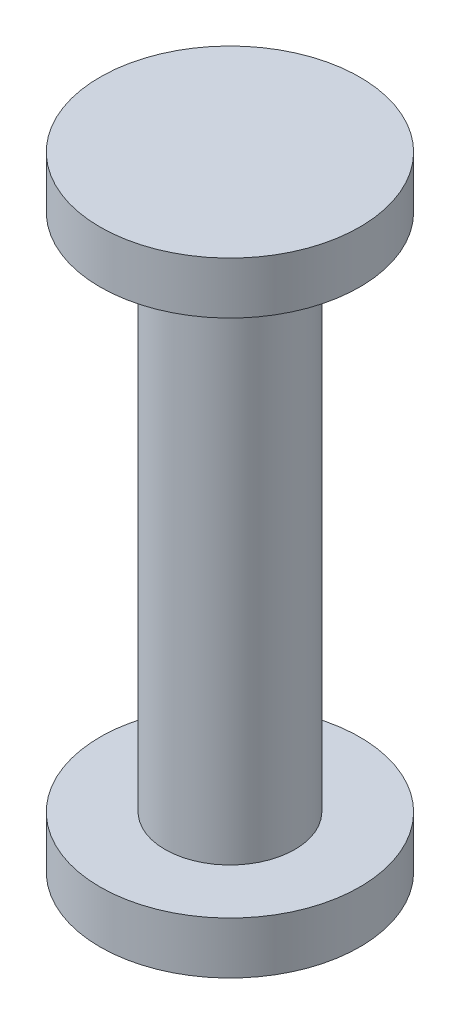
ISO-10303-21;
HEADER;
FILE_DESCRIPTION(('STEP AP214'),'2;1');
FILE_NAME('part.step','',(''),(''),'','','');
FILE_SCHEMA(('AUTOMOTIVE_DESIGN { 1 0 10303 214 1 1 1 1 }'));
ENDSEC;
DATA;
#1=APPLICATION_CONTEXT('core data for automotive mechanical design processes');
#2=APPLICATION_PROTOCOL_DEFINITION('international standard','automotive_design',2000,#1);
#3=PRODUCT_CONTEXT('',#1,'mechanical');
#4=PRODUCT('Part','Part','',(#3));
#5=PRODUCT_RELATED_PRODUCT_CATEGORY('part','',(#4));
#6=PRODUCT_DEFINITION_FORMATION('','',#4);
#7=PRODUCT_DEFINITION_CONTEXT('part definition',#1,'design');
#8=PRODUCT_DEFINITION('design','',#6,#7);
#9=PRODUCT_DEFINITION_SHAPE('','',#8);
#10=(LENGTH_UNIT() NAMED_UNIT(*) SI_UNIT(.MILLI.,.METRE.));
#11=(NAMED_UNIT(*) PLANE_ANGLE_UNIT() SI_UNIT($,.RADIAN.));
#12=(NAMED_UNIT(*) SI_UNIT($,.STERADIAN.) SOLID_ANGLE_UNIT());
#13=UNCERTAINTY_MEASURE_WITH_UNIT(LENGTH_MEASURE(1.E-05),#10,'distance_accuracy_value','');
#14=(GEOMETRIC_REPRESENTATION_CONTEXT(3) GLOBAL_UNCERTAINTY_ASSIGNED_CONTEXT((#13)) GLOBAL_UNIT_ASSIGNED_CONTEXT((#10,
#11,#12)) REPRESENTATION_CONTEXT('',''));
#15=CARTESIAN_POINT('',(0.,0.,0.));
#16=DIRECTION('',(0.,0.,1.));
#17=DIRECTION('',(1.,0.,0.));
#18=AXIS2_PLACEMENT_3D('',#15,#16,#17);
#19=CARTESIAN_POINT('',(0.,7.62,0.));
#20=DIRECTION('',(0.,1.,0.));
#21=DIRECTION('',(0.,0.,1.));
#22=AXIS2_PLACEMENT_3D('',#19,#20,#21);
#23=PLANE('',#22);
#24=CARTESIAN_POINT('',(0.,7.61999999999999,0.));
#25=DIRECTION('',(0.,1.,0.));
#26=DIRECTION('',(0.,0.,1.));
#27=AXIS2_PLACEMENT_3D('',#24,#25,#26);
#28=CIRCLE('',#27,3.17499999999999);
#29=CARTESIAN_POINT('',(0.,7.61999999999999,3.17499999999999));
#30=VERTEX_POINT('',#29);
#31=EDGE_CURVE('E70',#30,#30,#28,.T.);
#32=ORIENTED_EDGE('',*,*,#31,.T.);
#33=EDGE_LOOP('',(#32));
#34=FACE_BOUND('',#33,.T.);
#35=ADVANCED_FACE('F43',(#34),#23,.T.);
#36=CARTESIAN_POINT('',(0.,-7.62,0.));
#37=DIRECTION('',(0.,1.,0.));
#38=DIRECTION('',(0.,0.,1.));
#39=AXIS2_PLACEMENT_3D('',#36,#37,#38);
#40=PLANE('',#39);
#41=CARTESIAN_POINT('',(0.,-7.62,0.));
#42=DIRECTION('',(0.,1.,0.));
#43=DIRECTION('',(0.,0.,1.));
#44=AXIS2_PLACEMENT_3D('',#41,#42,#43);
#45=CIRCLE('',#44,3.175);
#46=CARTESIAN_POINT('',(0.,-7.62,3.175));
#47=VERTEX_POINT('',#46);
#48=EDGE_CURVE('E10',#47,#47,#45,.T.);
#49=ORIENTED_EDGE('',*,*,#48,.F.);
#50=EDGE_LOOP('',(#49));
#51=FACE_BOUND('',#50,.T.);
#52=ADVANCED_FACE('F88',(#51),#40,.F.);
#53=CARTESIAN_POINT('',(0.,55.,0.));
#54=DIRECTION('',(0.,1.,0.));
#55=DIRECTION('',(0.,0.,1.));
#56=AXIS2_PLACEMENT_3D('',#53,#54,#55);
#57=CYLINDRICAL_SURFACE('',#56,3.175);
#58=ORIENTED_EDGE('',*,*,#48,.T.);
#59=EDGE_LOOP('',(#58));
#60=FACE_BOUND('',#59,.T.);
#61=CARTESIAN_POINT('',(0.,-6.35,0.));
#62=DIRECTION('',(0.,1.,0.));
#63=DIRECTION('',(0.,0.,1.));
#64=AXIS2_PLACEMENT_3D('',#61,#62,#63);
#65=CIRCLE('',#64,3.175);
#66=CARTESIAN_POINT('',(0.,-6.35,3.175));
#67=VERTEX_POINT('',#66);
#68=EDGE_CURVE('E50',#67,#67,#65,.T.);
#69=ORIENTED_EDGE('',*,*,#68,.F.);
#70=EDGE_LOOP('',(#69));
#71=FACE_BOUND('',#70,.T.);
#72=ADVANCED_FACE('F92',(#60,#71),#57,.T.);
#73=CARTESIAN_POINT('',(0.,-6.35,0.));
#74=DIRECTION('',(0.,1.,0.));
#75=DIRECTION('',(0.,0.,1.));
#76=AXIS2_PLACEMENT_3D('',#73,#74,#75);
#77=PLANE('',#76);
#78=ORIENTED_EDGE('',*,*,#68,.T.);
#79=EDGE_LOOP('',(#78));
#80=FACE_BOUND('',#79,.T.);
#81=CARTESIAN_POINT('',(0.,-6.34999999999999,0.));
#82=DIRECTION('',(0.,1.,0.));
#83=DIRECTION('',(0.,0.,1.));
#84=AXIS2_PLACEMENT_3D('',#81,#82,#83);
#85=CIRCLE('',#84,1.5875);
#86=CARTESIAN_POINT('',(0.,-6.34999999999999,1.5875));
#87=VERTEX_POINT('',#86);
#88=EDGE_CURVE('E55',#87,#87,#85,.T.);
#89=ORIENTED_EDGE('',*,*,#88,.F.);
#90=EDGE_LOOP('',(#89));
#91=FACE_BOUND('',#90,.T.);
#92=ADVANCED_FACE('F97',(#80,#91),#77,.T.);
#93=CARTESIAN_POINT('',(0.,55.,0.));
#94=DIRECTION('',(0.,1.,0.));
#95=DIRECTION('',(0.,0.,1.));
#96=AXIS2_PLACEMENT_3D('',#93,#94,#95);
#97=CYLINDRICAL_SURFACE('',#96,1.5875);
#98=ORIENTED_EDGE('',*,*,#88,.T.);
#99=EDGE_LOOP('',(#98));
#100=FACE_BOUND('',#99,.T.);
#101=CARTESIAN_POINT('',(0.,6.34999999999999,0.));
#102=DIRECTION('',(0.,1.,0.));
#103=DIRECTION('',(0.,0.,1.));
#104=AXIS2_PLACEMENT_3D('',#101,#102,#103);
#105=CIRCLE('',#104,1.5875);
#106=CARTESIAN_POINT('',(0.,6.34999999999999,1.5875));
#107=VERTEX_POINT('',#106);
#108=EDGE_CURVE('E60',#107,#107,#105,.T.);
#109=ORIENTED_EDGE('',*,*,#108,.F.);
#110=EDGE_LOOP('',(#109));
#111=FACE_BOUND('',#110,.T.);
#112=ADVANCED_FACE('F84',(#100,#111),#97,.T.);
#113=CARTESIAN_POINT('',(0.,6.35,0.));
#114=DIRECTION('',(0.,-1.,0.));
#115=DIRECTION('',(0.,0.,-1.));
#116=AXIS2_PLACEMENT_3D('',#113,#114,#115);
#117=PLANE('',#116);
#118=ORIENTED_EDGE('',*,*,#108,.T.);
#119=EDGE_LOOP('',(#118));
#120=FACE_BOUND('',#119,.T.);
#121=CARTESIAN_POINT('',(0.,6.35,0.));
#122=DIRECTION('',(0.,1.,0.));
#123=DIRECTION('',(0.,0.,1.));
#124=AXIS2_PLACEMENT_3D('',#121,#122,#123);
#125=CIRCLE('',#124,3.17500000000001);
#126=CARTESIAN_POINT('',(0.,6.35,3.17500000000001));
#127=VERTEX_POINT('',#126);
#128=EDGE_CURVE('E66',#127,#127,#125,.T.);
#129=ORIENTED_EDGE('',*,*,#128,.F.);
#130=EDGE_LOOP('',(#129));
#131=FACE_BOUND('',#130,.T.);
#132=ADVANCED_FACE('F78',(#120,#131),#117,.T.);
#133=CARTESIAN_POINT('',(0.,55.,0.));
#134=DIRECTION('',(0.,1.,0.));
#135=DIRECTION('',(0.,0.,1.));
#136=AXIS2_PLACEMENT_3D('',#133,#134,#135);
#137=CYLINDRICAL_SURFACE('',#136,3.175);
#138=ORIENTED_EDGE('',*,*,#128,.T.);
#139=EDGE_LOOP('',(#138));
#140=FACE_BOUND('',#139,.T.);
#141=ORIENTED_EDGE('',*,*,#31,.F.);
#142=EDGE_LOOP('',(#141));
#143=FACE_BOUND('',#142,.T.);
#144=ADVANCED_FACE('F76',(#140,#143),#137,.T.);
#145=CLOSED_SHELL('',(#35,#52,#72,#92,#112,#132,#144));
#146=MANIFOLD_SOLID_BREP('B2',#145);
#147=ADVANCED_BREP_SHAPE_REPRESENTATION('',(#18,#146),#14);
#148=SHAPE_DEFINITION_REPRESENTATION(#9,#147);
ENDSEC;
END-ISO-10303-21;
